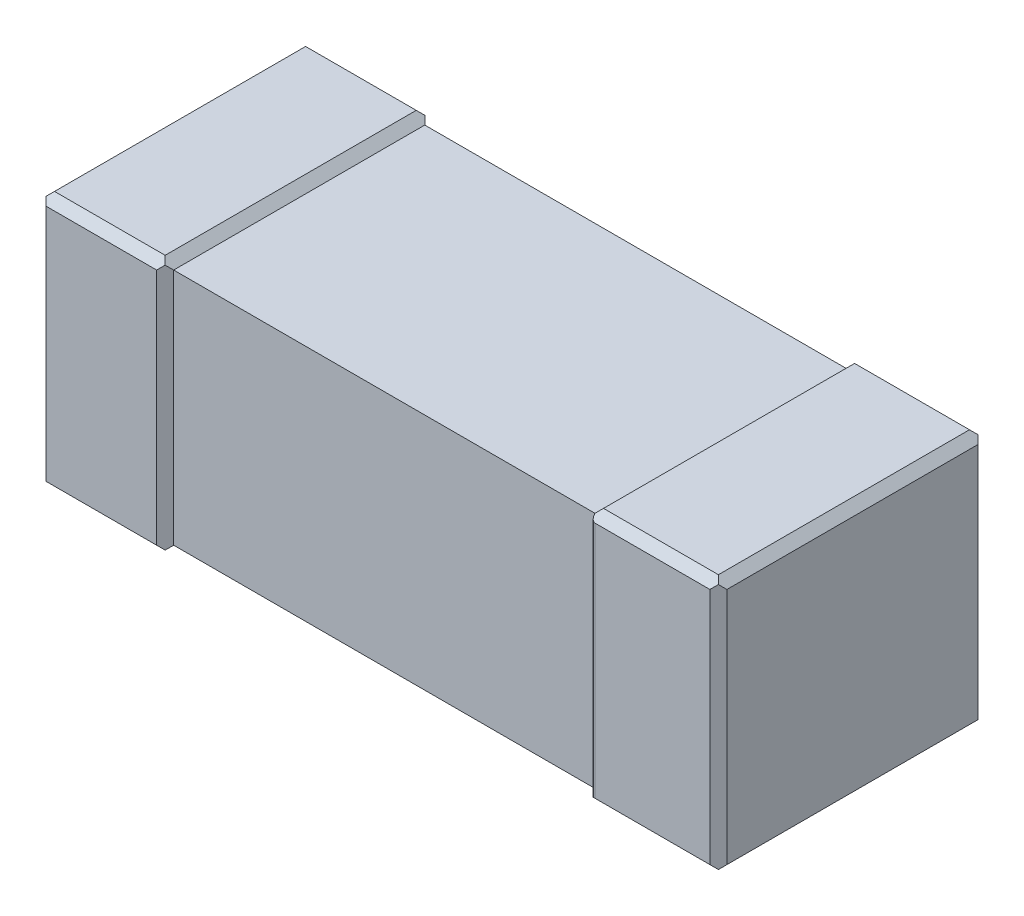
ISO-10303-21;
HEADER;
FILE_DESCRIPTION(('STEP AP214'),'2;1');
FILE_NAME('part.step','',(''),(''),'','','');
FILE_SCHEMA(('AUTOMOTIVE_DESIGN { 1 0 10303 214 1 1 1 1 }'));
ENDSEC;
DATA;
#1=APPLICATION_CONTEXT('core data for automotive mechanical design processes');
#2=APPLICATION_PROTOCOL_DEFINITION('international standard','automotive_design',2000,#1);
#3=PRODUCT_CONTEXT('',#1,'mechanical');
#4=PRODUCT('Part','Part','',(#3));
#5=PRODUCT_RELATED_PRODUCT_CATEGORY('part','',(#4));
#6=PRODUCT_DEFINITION_FORMATION('','',#4);
#7=PRODUCT_DEFINITION_CONTEXT('part definition',#1,'design');
#8=PRODUCT_DEFINITION('design','',#6,#7);
#9=PRODUCT_DEFINITION_SHAPE('','',#8);
#10=(LENGTH_UNIT() NAMED_UNIT(*) SI_UNIT(.MILLI.,.METRE.));
#11=(NAMED_UNIT(*) PLANE_ANGLE_UNIT() SI_UNIT($,.RADIAN.));
#12=(NAMED_UNIT(*) SI_UNIT($,.STERADIAN.) SOLID_ANGLE_UNIT());
#13=UNCERTAINTY_MEASURE_WITH_UNIT(LENGTH_MEASURE(1.E-05),#10,'distance_accuracy_value','');
#14=(GEOMETRIC_REPRESENTATION_CONTEXT(3) GLOBAL_UNCERTAINTY_ASSIGNED_CONTEXT((#13)) GLOBAL_UNIT_ASSIGNED_CONTEXT((#10,
#11,#12)) REPRESENTATION_CONTEXT('',''));
#15=CARTESIAN_POINT('',(0.,0.,0.));
#16=DIRECTION('',(0.,0.,1.));
#17=DIRECTION('',(1.,0.,0.));
#18=AXIS2_PLACEMENT_3D('',#15,#16,#17);
#19=CARTESIAN_POINT('',(0.8,-0.3,0.));
#20=DIRECTION('',(1.,0.,0.));
#21=DIRECTION('',(0.,0.,-1.));
#22=AXIS2_PLACEMENT_3D('',#19,#20,#21);
#23=PLANE('',#22);
#24=DIRECTION('',(0.,0.,1.));
#25=VECTOR('',#24,1.);
#26=CARTESIAN_POINT('',(0.8,0.28,0.63));
#27=LINE('',#26,#25);
#28=CARTESIAN_POINT('',(0.8,0.28,0.61));
#29=VERTEX_POINT('',#28);
#30=CARTESIAN_POINT('',(0.8,0.28,0.0199999999999999));
#31=VERTEX_POINT('',#30);
#32=EDGE_CURVE('E465',#29,#31,#27,.F.);
#33=ORIENTED_EDGE('',*,*,#32,.F.);
#34=DIRECTION('',(0.,1.,0.));
#35=VECTOR('',#34,1.);
#36=CARTESIAN_POINT('',(0.8,-0.3,0.61));
#37=LINE('',#36,#35);
#38=CARTESIAN_POINT('',(0.8,-0.28,0.61));
#39=VERTEX_POINT('',#38);
#40=EDGE_CURVE('E437',#39,#29,#37,.T.);
#41=ORIENTED_EDGE('',*,*,#40,.F.);
#42=DIRECTION('',(0.,0.,1.));
#43=VECTOR('',#42,1.);
#44=CARTESIAN_POINT('',(0.8,-0.28,0.));
#45=LINE('',#44,#43);
#46=CARTESIAN_POINT('',(0.8,-0.28,0.02));
#47=VERTEX_POINT('',#46);
#48=EDGE_CURVE('E438',#47,#39,#45,.T.);
#49=ORIENTED_EDGE('',*,*,#48,.F.);
#50=DIRECTION('',(0.,1.,0.));
#51=VECTOR('',#50,1.);
#52=CARTESIAN_POINT('',(0.8,0.3,0.02));
#53=LINE('',#52,#51);
#54=EDGE_CURVE('E464',#31,#47,#53,.F.);
#55=ORIENTED_EDGE('',*,*,#54,.F.);
#56=EDGE_LOOP('',(#33,#41,#49,#55));
#57=FACE_BOUND('',#56,.T.);
#58=ADVANCED_FACE('F16',(#57),#23,.T.);
#59=CARTESIAN_POINT('',(0.79,0.29,0.63));
#60=DIRECTION('',(0.707106781186548,0.707106781186548,0.));
#61=DIRECTION('',(-0.707106781186548,0.707106781186548,0.));
#62=AXIS2_PLACEMENT_3D('',#59,#60,#61);
#63=PLANE('',#62);
#64=DIRECTION('',(0.577350269189624,-0.577350269189627,-0.577350269189627));
#65=VECTOR('',#64,1.);
#66=CARTESIAN_POINT('',(0.78,0.3,0.02));
#67=LINE('',#66,#65);
#68=CARTESIAN_POINT('',(0.78,0.3,0.02));
#69=VERTEX_POINT('',#68);
#70=CARTESIAN_POINT('',(0.79,0.29,0.00999999999999999));
#71=VERTEX_POINT('',#70);
#72=EDGE_CURVE('E399',#69,#71,#67,.T.);
#73=ORIENTED_EDGE('',*,*,#72,.F.);
#74=DIRECTION('',(0.,0.,1.));
#75=VECTOR('',#74,1.);
#76=CARTESIAN_POINT('',(0.78,0.3,0.63));
#77=LINE('',#76,#75);
#78=CARTESIAN_POINT('',(0.78,0.3,0.61));
#79=VERTEX_POINT('',#78);
#80=EDGE_CURVE('E376',#79,#69,#77,.F.);
#81=ORIENTED_EDGE('',*,*,#80,.F.);
#82=DIRECTION('',(-0.577350269189621,0.57735026918963,-0.577350269189627));
#83=VECTOR('',#82,1.);
#84=CARTESIAN_POINT('',(0.79,0.29,0.62));
#85=LINE('',#84,#83);
#86=CARTESIAN_POINT('',(0.79,0.29,0.62));
#87=VERTEX_POINT('',#86);
#88=EDGE_CURVE('E431',#87,#79,#85,.T.);
#89=ORIENTED_EDGE('',*,*,#88,.F.);
#90=DIRECTION('',(-0.577350269189626,0.577350269189626,0.577350269189626));
#91=VECTOR('',#90,1.);
#92=CARTESIAN_POINT('',(0.8,0.28,0.61));
#93=LINE('',#92,#91);
#94=EDGE_CURVE('E478',#29,#87,#93,.T.);
#95=ORIENTED_EDGE('',*,*,#94,.F.);
#96=ORIENTED_EDGE('',*,*,#32,.T.);
#97=DIRECTION('',(0.577350269189627,-0.577350269189624,0.577350269189627));
#98=VECTOR('',#97,1.);
#99=CARTESIAN_POINT('',(0.79,0.29,0.01));
#100=LINE('',#99,#98);
#101=EDGE_CURVE('E461',#71,#31,#100,.T.);
#102=ORIENTED_EDGE('',*,*,#101,.F.);
#103=EDGE_LOOP('',(#73,#81,#89,#95,#96,#102));
#104=FACE_BOUND('',#103,.T.);
#105=ADVANCED_FACE('F951',(#104),#63,.T.);
#106=CARTESIAN_POINT('',(0.79,0.3,0.01));
#107=DIRECTION('',(0.707106781186548,0.,-0.707106781186548));
#108=DIRECTION('',(-0.707106781186548,0.,-0.707106781186548));
#109=AXIS2_PLACEMENT_3D('',#106,#107,#108);
#110=PLANE('',#109);
#111=DIRECTION('',(0.57735026918962,-0.577350269189629,0.577350269189629));
#112=VECTOR('',#111,1.);
#113=CARTESIAN_POINT('',(0.78,-0.28,0.));
#114=LINE('',#113,#112);
#115=CARTESIAN_POINT('',(0.78,-0.28,0.));
#116=VERTEX_POINT('',#115);
#117=CARTESIAN_POINT('',(0.79,-0.29,0.00999999999999999));
#118=VERTEX_POINT('',#117);
#119=EDGE_CURVE('E422',#116,#118,#114,.T.);
#120=ORIENTED_EDGE('',*,*,#119,.F.);
#121=DIRECTION('',(0.,1.,0.));
#122=VECTOR('',#121,1.);
#123=CARTESIAN_POINT('',(0.78,0.3,0.));
#124=LINE('',#123,#122);
#125=CARTESIAN_POINT('',(0.78,0.28,0.));
#126=VERTEX_POINT('',#125);
#127=EDGE_CURVE('E400',#126,#116,#124,.F.);
#128=ORIENTED_EDGE('',*,*,#127,.F.);
#129=DIRECTION('',(-0.577350269189616,-0.577350269189631,-0.57735026918963));
#130=VECTOR('',#129,1.);
#131=CARTESIAN_POINT('',(0.79,0.29,0.00999999999999998));
#132=LINE('',#131,#130);
#133=EDGE_CURVE('E377',#71,#126,#132,.T.);
#134=ORIENTED_EDGE('',*,*,#133,.F.);
#135=ORIENTED_EDGE('',*,*,#101,.T.);
#136=ORIENTED_EDGE('',*,*,#54,.T.);
#137=DIRECTION('',(0.577350269189626,0.577350269189626,0.577350269189625));
#138=VECTOR('',#137,1.);
#139=CARTESIAN_POINT('',(0.79,-0.29,0.01));
#140=LINE('',#139,#138);
#141=EDGE_CURVE('E434',#118,#47,#140,.T.);
#142=ORIENTED_EDGE('',*,*,#141,.F.);
#143=EDGE_LOOP('',(#120,#128,#134,#135,#136,#142));
#144=FACE_BOUND('',#143,.T.);
#145=ADVANCED_FACE('F941',(#144),#110,.T.);
#146=CARTESIAN_POINT('',(0.79,-0.29,0.));
#147=DIRECTION('',(0.707106781186548,-0.707106781186548,0.));
#148=DIRECTION('',(0.707106781186548,0.707106781186548,0.));
#149=AXIS2_PLACEMENT_3D('',#146,#147,#148);
#150=PLANE('',#149);
#151=DIRECTION('',(-0.577350269189624,-0.577350269189627,0.577350269189627));
#152=VECTOR('',#151,1.);
#153=CARTESIAN_POINT('',(0.79,-0.29,0.00999999999999998));
#154=LINE('',#153,#152);
#155=CARTESIAN_POINT('',(0.78,-0.3,0.02));
#156=VERTEX_POINT('',#155);
#157=EDGE_CURVE('E390',#118,#156,#154,.T.);
#158=ORIENTED_EDGE('',*,*,#157,.F.);
#159=ORIENTED_EDGE('',*,*,#141,.T.);
#160=ORIENTED_EDGE('',*,*,#48,.T.);
#161=DIRECTION('',(0.577350269189627,0.577350269189624,-0.577350269189627));
#162=VECTOR('',#161,1.);
#163=CARTESIAN_POINT('',(0.79,-0.29,0.62));
#164=LINE('',#163,#162);
#165=CARTESIAN_POINT('',(0.79,-0.29,0.62));
#166=VERTEX_POINT('',#165);
#167=EDGE_CURVE('E408',#166,#39,#164,.T.);
#168=ORIENTED_EDGE('',*,*,#167,.F.);
#169=DIRECTION('',(0.577350269189621,0.57735026918963,0.577350269189627));
#170=VECTOR('',#169,1.);
#171=CARTESIAN_POINT('',(0.78,-0.3,0.61));
#172=LINE('',#171,#170);
#173=CARTESIAN_POINT('',(0.78,-0.3,0.61));
#174=VERTEX_POINT('',#173);
#175=EDGE_CURVE('E353',#174,#166,#172,.T.);
#176=ORIENTED_EDGE('',*,*,#175,.F.);
#177=DIRECTION('',(0.,0.,-1.));
#178=VECTOR('',#177,1.);
#179=CARTESIAN_POINT('',(0.78,-0.3,0.));
#180=LINE('',#179,#178);
#181=EDGE_CURVE('E357',#156,#174,#180,.F.);
#182=ORIENTED_EDGE('',*,*,#181,.F.);
#183=EDGE_LOOP('',(#158,#159,#160,#168,#176,#182));
#184=FACE_BOUND('',#183,.T.);
#185=ADVANCED_FACE('F931',(#184),#150,.T.);
#186=CARTESIAN_POINT('',(0.79,-0.3,0.62));
#187=DIRECTION('',(0.707106781186548,0.,0.707106781186548));
#188=DIRECTION('',(0.707106781186548,0.,-0.707106781186548));
#189=AXIS2_PLACEMENT_3D('',#186,#187,#188);
#190=PLANE('',#189);
#191=DIRECTION('',(-0.577350269189624,0.577350269189624,0.57735026918963));
#192=VECTOR('',#191,1.);
#193=CARTESIAN_POINT('',(0.79,-0.29,0.62));
#194=LINE('',#193,#192);
#195=CARTESIAN_POINT('',(0.78,-0.28,0.63));
#196=VERTEX_POINT('',#195);
#197=EDGE_CURVE('E350',#166,#196,#194,.T.);
#198=ORIENTED_EDGE('',*,*,#197,.F.);
#199=ORIENTED_EDGE('',*,*,#167,.T.);
#200=ORIENTED_EDGE('',*,*,#40,.T.);
#201=ORIENTED_EDGE('',*,*,#94,.T.);
#202=DIRECTION('',(0.577350269189624,0.577350269189624,-0.57735026918963));
#203=VECTOR('',#202,1.);
#204=CARTESIAN_POINT('',(0.78,0.28,0.63));
#205=LINE('',#204,#203);
#206=CARTESIAN_POINT('',(0.78,0.28,0.63));
#207=VERTEX_POINT('',#206);
#208=EDGE_CURVE('E369',#207,#87,#205,.T.);
#209=ORIENTED_EDGE('',*,*,#208,.F.);
#210=DIRECTION('',(0.,-1.,0.));
#211=VECTOR('',#210,1.);
#212=CARTESIAN_POINT('',(0.78,-0.3,0.63));
#213=LINE('',#212,#211);
#214=EDGE_CURVE('E385',#196,#207,#213,.F.);
#215=ORIENTED_EDGE('',*,*,#214,.F.);
#216=EDGE_LOOP('',(#198,#199,#200,#201,#209,#215));
#217=FACE_BOUND('',#216,.T.);
#218=ADVANCED_FACE('F921',(#217),#190,.T.);
#219=CARTESIAN_POINT('',(-0.8,-0.3,0.63));
#220=DIRECTION('',(0.,-1.,0.));
#221=DIRECTION('',(0.,0.,-1.));
#222=AXIS2_PLACEMENT_3D('',#219,#220,#221);
#223=PLANE('',#222);
#224=DIRECTION('',(1.,0.,0.));
#225=VECTOR('',#224,1.);
#226=CARTESIAN_POINT('',(-0.52,-0.3,0.02));
#227=LINE('',#226,#225);
#228=CARTESIAN_POINT('',(-0.52,-0.3,0.0200000000000001));
#229=VERTEX_POINT('',#228);
#230=CARTESIAN_POINT('',(-0.78,-0.3,0.02));
#231=VERTEX_POINT('',#230);
#232=EDGE_CURVE('E332',#229,#231,#227,.F.);
#233=ORIENTED_EDGE('',*,*,#232,.F.);
#234=DIRECTION('',(0.,0.,1.));
#235=VECTOR('',#234,1.);
#236=CARTESIAN_POINT('',(-0.52,-0.3,0.63));
#237=LINE('',#236,#235);
#238=CARTESIAN_POINT('',(-0.52,-0.3,0.61));
#239=VERTEX_POINT('',#238);
#240=EDGE_CURVE('E318',#239,#229,#237,.F.);
#241=ORIENTED_EDGE('',*,*,#240,.F.);
#242=DIRECTION('',(1.,0.,0.));
#243=VECTOR('',#242,1.);
#244=CARTESIAN_POINT('',(-0.8,-0.3,0.61));
#245=LINE('',#244,#243);
#246=CARTESIAN_POINT('',(-0.78,-0.3,0.61));
#247=VERTEX_POINT('',#246);
#248=EDGE_CURVE('E327',#247,#239,#245,.T.);
#249=ORIENTED_EDGE('',*,*,#248,.F.);
#250=DIRECTION('',(0.,0.,1.));
#251=VECTOR('',#250,1.);
#252=CARTESIAN_POINT('',(-0.78,-0.3,0.02));
#253=LINE('',#252,#251);
#254=EDGE_CURVE('E405',#231,#247,#253,.T.);
#255=ORIENTED_EDGE('',*,*,#254,.F.);
#256=EDGE_LOOP('',(#233,#241,#249,#255));
#257=FACE_BOUND('',#256,.T.);
#258=ADVANCED_FACE('F911',(#257),#223,.T.);
#259=CARTESIAN_POINT('',(-0.79,-0.29,0.02));
#260=DIRECTION('',(-0.707106781186548,-0.707106781186548,0.));
#261=DIRECTION('',(0.707106781186548,-0.707106781186548,0.));
#262=AXIS2_PLACEMENT_3D('',#259,#260,#261);
#263=PLANE('',#262);
#264=DIRECTION('',(0.577350269189622,-0.577350269189628,-0.577350269189628));
#265=VECTOR('',#264,1.);
#266=CARTESIAN_POINT('',(-0.79,-0.29,0.62));
#267=LINE('',#266,#265);
#268=CARTESIAN_POINT('',(-0.79,-0.29,0.62));
#269=VERTEX_POINT('',#268);
#270=EDGE_CURVE('E324',#269,#247,#267,.T.);
#271=ORIENTED_EDGE('',*,*,#270,.F.);
#272=DIRECTION('',(0.577350269189628,-0.577350269189622,0.577350269189628));
#273=VECTOR('',#272,1.);
#274=CARTESIAN_POINT('',(-0.8,-0.28,0.61));
#275=LINE('',#274,#273);
#276=CARTESIAN_POINT('',(-0.8,-0.28,0.61));
#277=VERTEX_POINT('',#276);
#278=EDGE_CURVE('E310',#277,#269,#275,.T.);
#279=ORIENTED_EDGE('',*,*,#278,.F.);
#280=DIRECTION('',(0.,0.,1.));
#281=VECTOR('',#280,1.);
#282=CARTESIAN_POINT('',(-0.8,-0.28,0.));
#283=LINE('',#282,#281);
#284=CARTESIAN_POINT('',(-0.8,-0.28,0.02));
#285=VERTEX_POINT('',#284);
#286=EDGE_CURVE('E403',#285,#277,#283,.T.);
#287=ORIENTED_EDGE('',*,*,#286,.F.);
#288=DIRECTION('',(-0.577350269189629,0.577350269189623,0.577350269189626));
#289=VECTOR('',#288,1.);
#290=CARTESIAN_POINT('',(-0.79,-0.29,0.0100000000000002));
#291=LINE('',#290,#289);
#292=CARTESIAN_POINT('',(-0.79,-0.29,0.0100000000000001));
#293=VERTEX_POINT('',#292);
#294=EDGE_CURVE('E347',#293,#285,#291,.T.);
#295=ORIENTED_EDGE('',*,*,#294,.F.);
#296=DIRECTION('',(-0.577350269189624,0.577350269189627,-0.577350269189627));
#297=VECTOR('',#296,1.);
#298=CARTESIAN_POINT('',(-0.78,-0.3,0.02));
#299=LINE('',#298,#297);
#300=EDGE_CURVE('E329',#231,#293,#299,.T.);
#301=ORIENTED_EDGE('',*,*,#300,.F.);
#302=ORIENTED_EDGE('',*,*,#254,.T.);
#303=EDGE_LOOP('',(#271,#279,#287,#295,#301,#302));
#304=FACE_BOUND('',#303,.T.);
#305=ADVANCED_FACE('F901',(#304),#263,.T.);
#306=CARTESIAN_POINT('',(-0.8,0.3,0.));
#307=DIRECTION('',(-1.,0.,0.));
#308=DIRECTION('',(0.,0.,1.));
#309=AXIS2_PLACEMENT_3D('',#306,#307,#308);
#310=PLANE('',#309);
#311=ORIENTED_EDGE('',*,*,#286,.T.);
#312=DIRECTION('',(0.,1.,0.));
#313=VECTOR('',#312,1.);
#314=CARTESIAN_POINT('',(-0.8,0.28,0.61));
#315=LINE('',#314,#313);
#316=CARTESIAN_POINT('',(-0.8,0.28,0.61));
#317=VERTEX_POINT('',#316);
#318=EDGE_CURVE('E313',#317,#277,#315,.F.);
#319=ORIENTED_EDGE('',*,*,#318,.F.);
#320=DIRECTION('',(0.,0.,1.));
#321=VECTOR('',#320,1.);
#322=CARTESIAN_POINT('',(-0.8,0.28,0.));
#323=LINE('',#322,#321);
#324=CARTESIAN_POINT('',(-0.8,0.28,0.02));
#325=VERTEX_POINT('',#324);
#326=EDGE_CURVE('E298',#317,#325,#323,.F.);
#327=ORIENTED_EDGE('',*,*,#326,.T.);
#328=DIRECTION('',(0.,1.,0.));
#329=VECTOR('',#328,1.);
#330=CARTESIAN_POINT('',(-0.8,0.28,0.02));
#331=LINE('',#330,#329);
#332=EDGE_CURVE('E344',#285,#325,#331,.T.);
#333=ORIENTED_EDGE('',*,*,#332,.F.);
#334=EDGE_LOOP('',(#311,#319,#327,#333));
#335=FACE_BOUND('',#334,.T.);
#336=ADVANCED_FACE('F891',(#335),#310,.T.);
#337=CARTESIAN_POINT('',(0.5,0.3,0.));
#338=DIRECTION('',(0.,0.,-1.));
#339=DIRECTION('',(0.,1.,0.));
#340=AXIS2_PLACEMENT_3D('',#337,#338,#339);
#341=PLANE('',#340);
#342=DIRECTION('',(1.,0.,0.));
#343=VECTOR('',#342,1.);
#344=CARTESIAN_POINT('',(0.5,-0.28,0.));
#345=LINE('',#344,#343);
#346=CARTESIAN_POINT('',(0.51,-0.28,0.));
#347=VERTEX_POINT('',#346);
#348=EDGE_CURVE('E363',#347,#116,#345,.T.);
#349=ORIENTED_EDGE('',*,*,#348,.F.);
#350=DIRECTION('',(0.,1.,0.));
#351=VECTOR('',#350,1.);
#352=CARTESIAN_POINT('',(0.51,0.28,0.));
#353=LINE('',#352,#351);
#354=CARTESIAN_POINT('',(0.51,0.28,0.));
#355=VERTEX_POINT('',#354);
#356=EDGE_CURVE('E281',#347,#355,#353,.T.);
#357=ORIENTED_EDGE('',*,*,#356,.T.);
#358=DIRECTION('',(1.,0.,0.));
#359=VECTOR('',#358,1.);
#360=CARTESIAN_POINT('',(0.5,0.28,0.));
#361=LINE('',#360,#359);
#362=EDGE_CURVE('E397',#126,#355,#361,.F.);
#363=ORIENTED_EDGE('',*,*,#362,.F.);
#364=ORIENTED_EDGE('',*,*,#127,.T.);
#365=EDGE_LOOP('',(#349,#357,#363,#364));
#366=FACE_BOUND('',#365,.T.);
#367=ADVANCED_FACE('F881',(#366),#341,.T.);
#368=CARTESIAN_POINT('',(0.5,0.29,0.01));
#369=DIRECTION('',(0.,0.707106781186548,-0.707106781186548));
#370=DIRECTION('',(0.,0.707106781186548,0.707106781186548));
#371=AXIS2_PLACEMENT_3D('',#368,#369,#370);
#372=PLANE('',#371);
#373=ORIENTED_EDGE('',*,*,#72,.T.);
#374=ORIENTED_EDGE('',*,*,#133,.T.);
#375=ORIENTED_EDGE('',*,*,#362,.T.);
#376=DIRECTION('',(-0.577350269189629,0.57735026918962,0.577350269189629));
#377=VECTOR('',#376,1.);
#378=CARTESIAN_POINT('',(0.51,0.28,0.));
#379=LINE('',#378,#377);
#380=CARTESIAN_POINT('',(0.5,0.29,0.00999999999999998));
#381=VERTEX_POINT('',#380);
#382=EDGE_CURVE('E290',#355,#381,#379,.T.);
#383=ORIENTED_EDGE('',*,*,#382,.T.);
#384=DIRECTION('',(0.577350269189625,0.577350269189628,0.577350269189625));
#385=VECTOR('',#384,1.);
#386=CARTESIAN_POINT('',(0.5,0.29,0.00999999999999981));
#387=LINE('',#386,#385);
#388=CARTESIAN_POINT('',(0.51,0.3,0.0199999999999998));
#389=VERTEX_POINT('',#388);
#390=EDGE_CURVE('E280',#381,#389,#387,.T.);
#391=ORIENTED_EDGE('',*,*,#390,.T.);
#392=DIRECTION('',(1.,0.,0.));
#393=VECTOR('',#392,1.);
#394=CARTESIAN_POINT('',(0.5,0.3,0.0200000000000001));
#395=LINE('',#394,#393);
#396=EDGE_CURVE('E373',#69,#389,#395,.F.);
#397=ORIENTED_EDGE('',*,*,#396,.F.);
#398=EDGE_LOOP('',(#373,#374,#375,#383,#391,#397));
#399=FACE_BOUND('',#398,.T.);
#400=ADVANCED_FACE('F871',(#399),#372,.T.);
#401=CARTESIAN_POINT('',(0.5,0.3,0.63));
#402=DIRECTION('',(0.,1.,0.));
#403=DIRECTION('',(0.,0.,1.));
#404=AXIS2_PLACEMENT_3D('',#401,#402,#403);
#405=PLANE('',#404);
#406=DIRECTION('',(1.,0.,0.));
#407=VECTOR('',#406,1.);
#408=CARTESIAN_POINT('',(0.5,0.3,0.61));
#409=LINE('',#408,#407);
#410=CARTESIAN_POINT('',(0.51,0.3,0.61));
#411=VERTEX_POINT('',#410);
#412=EDGE_CURVE('E370',#79,#411,#409,.F.);
#413=ORIENTED_EDGE('',*,*,#412,.F.);
#414=ORIENTED_EDGE('',*,*,#80,.T.);
#415=ORIENTED_EDGE('',*,*,#396,.T.);
#416=DIRECTION('',(0.,0.,1.));
#417=VECTOR('',#416,1.);
#418=CARTESIAN_POINT('',(0.51,0.3,0.61));
#419=LINE('',#418,#417);
#420=EDGE_CURVE('E238',#389,#411,#419,.T.);
#421=ORIENTED_EDGE('',*,*,#420,.T.);
#422=EDGE_LOOP('',(#413,#414,#415,#421));
#423=FACE_BOUND('',#422,.T.);
#424=ADVANCED_FACE('F861',(#423),#405,.T.);
#425=CARTESIAN_POINT('',(0.5,-0.3,0.63));
#426=DIRECTION('',(0.,0.,1.));
#427=DIRECTION('',(0.,-1.,0.));
#428=AXIS2_PLACEMENT_3D('',#425,#426,#427);
#429=PLANE('',#428);
#430=DIRECTION('',(1.,0.,0.));
#431=VECTOR('',#430,1.);
#432=CARTESIAN_POINT('',(0.5,0.28,0.63));
#433=LINE('',#432,#431);
#434=CARTESIAN_POINT('',(0.51,0.28,0.63));
#435=VERTEX_POINT('',#434);
#436=EDGE_CURVE('E366',#435,#207,#433,.T.);
#437=ORIENTED_EDGE('',*,*,#436,.F.);
#438=DIRECTION('',(0.,1.,0.));
#439=VECTOR('',#438,1.);
#440=CARTESIAN_POINT('',(0.51,-0.28,0.63));
#441=LINE('',#440,#439);
#442=CARTESIAN_POINT('',(0.51,-0.28,0.63));
#443=VERTEX_POINT('',#442);
#444=EDGE_CURVE('E237',#443,#435,#441,.T.);
#445=ORIENTED_EDGE('',*,*,#444,.F.);
#446=DIRECTION('',(1.,0.,0.));
#447=VECTOR('',#446,1.);
#448=CARTESIAN_POINT('',(0.5,-0.28,0.63));
#449=LINE('',#448,#447);
#450=EDGE_CURVE('E233',#196,#443,#449,.F.);
#451=ORIENTED_EDGE('',*,*,#450,.F.);
#452=ORIENTED_EDGE('',*,*,#214,.T.);
#453=EDGE_LOOP('',(#437,#445,#451,#452));
#454=FACE_BOUND('',#453,.T.);
#455=ADVANCED_FACE('F851',(#454),#429,.T.);
#456=CARTESIAN_POINT('',(0.5,0.29,0.62));
#457=DIRECTION('',(0.,0.707106781186548,0.707106781186548));
#458=DIRECTION('',(0.,-0.707106781186548,0.707106781186548));
#459=AXIS2_PLACEMENT_3D('',#456,#457,#458);
#460=PLANE('',#459);
#461=ORIENTED_EDGE('',*,*,#208,.T.);
#462=ORIENTED_EDGE('',*,*,#88,.T.);
#463=ORIENTED_EDGE('',*,*,#412,.T.);
#464=DIRECTION('',(-0.577350269189626,-0.577350269189626,0.577350269189626));
#465=VECTOR('',#464,1.);
#466=CARTESIAN_POINT('',(0.51,0.3,0.61));
#467=LINE('',#466,#465);
#468=CARTESIAN_POINT('',(0.5,0.29,0.62));
#469=VERTEX_POINT('',#468);
#470=EDGE_CURVE('E278',#411,#469,#467,.T.);
#471=ORIENTED_EDGE('',*,*,#470,.T.);
#472=CARTESIAN_POINT('',(0.51,0.29,0.62));
#473=DIRECTION('',(0.,0.707106781186548,0.707106781186548));
#474=DIRECTION('',(0.,0.707106781186548,-0.707106781186548));
#475=AXIS2_PLACEMENT_3D('',#472,#473,#474);
#476=ELLIPSE('',#475,0.014142135623731,0.01);
#477=EDGE_CURVE('E244',#435,#469,#476,.F.);
#478=ORIENTED_EDGE('',*,*,#477,.F.);
#479=ORIENTED_EDGE('',*,*,#436,.T.);
#480=EDGE_LOOP('',(#461,#462,#463,#471,#478,#479));
#481=FACE_BOUND('',#480,.T.);
#482=ADVANCED_FACE('F841',(#481),#460,.T.);
#483=CARTESIAN_POINT('',(0.5,-0.29,0.01));
#484=DIRECTION('',(0.,-0.707106781186548,-0.707106781186548));
#485=DIRECTION('',(0.,0.707106781186548,-0.707106781186548));
#486=AXIS2_PLACEMENT_3D('',#483,#484,#485);
#487=PLANE('',#486);
#488=DIRECTION('',(0.577350269189628,0.577350269189621,-0.577350269189628));
#489=VECTOR('',#488,1.);
#490=CARTESIAN_POINT('',(0.5,-0.29,0.0100000000000001));
#491=LINE('',#490,#489);
#492=CARTESIAN_POINT('',(0.5,-0.29,0.0100000000000001));
#493=VERTEX_POINT('',#492);
#494=EDGE_CURVE('E287',#493,#347,#491,.T.);
#495=ORIENTED_EDGE('',*,*,#494,.T.);
#496=ORIENTED_EDGE('',*,*,#348,.T.);
#497=ORIENTED_EDGE('',*,*,#119,.T.);
#498=ORIENTED_EDGE('',*,*,#157,.T.);
#499=DIRECTION('',(1.,0.,0.));
#500=VECTOR('',#499,1.);
#501=CARTESIAN_POINT('',(0.5,-0.3,0.02));
#502=LINE('',#501,#500);
#503=CARTESIAN_POINT('',(0.51,-0.3,0.02));
#504=VERTEX_POINT('',#503);
#505=EDGE_CURVE('E360',#504,#156,#502,.T.);
#506=ORIENTED_EDGE('',*,*,#505,.F.);
#507=CARTESIAN_POINT('',(0.51,-0.29,0.01));
#508=DIRECTION('',(0.,-0.707106781186548,-0.707106781186548));
#509=DIRECTION('',(0.,-0.707106781186548,0.707106781186548));
#510=AXIS2_PLACEMENT_3D('',#507,#508,#509);
#511=ELLIPSE('',#510,0.0141421356237309,0.01);
#512=EDGE_CURVE('E491',#493,#504,#511,.F.);
#513=ORIENTED_EDGE('',*,*,#512,.F.);
#514=EDGE_LOOP('',(#495,#496,#497,#498,#506,#513));
#515=FACE_BOUND('',#514,.T.);
#516=ADVANCED_FACE('F831',(#515),#487,.T.);
#517=CARTESIAN_POINT('',(0.5,-0.3,0.));
#518=DIRECTION('',(0.,-1.,0.));
#519=DIRECTION('',(0.,0.,-1.));
#520=AXIS2_PLACEMENT_3D('',#517,#518,#519);
#521=PLANE('',#520);
#522=DIRECTION('',(1.,0.,0.));
#523=VECTOR('',#522,1.);
#524=CARTESIAN_POINT('',(0.5,-0.3,0.61));
#525=LINE('',#524,#523);
#526=CARTESIAN_POINT('',(0.51,-0.3,0.61));
#527=VERTEX_POINT('',#526);
#528=EDGE_CURVE('E351',#527,#174,#525,.T.);
#529=ORIENTED_EDGE('',*,*,#528,.F.);
#530=DIRECTION('',(0.,0.,1.));
#531=VECTOR('',#530,1.);
#532=CARTESIAN_POINT('',(0.51,-0.3,0.02));
#533=LINE('',#532,#531);
#534=EDGE_CURVE('E257',#504,#527,#533,.T.);
#535=ORIENTED_EDGE('',*,*,#534,.F.);
#536=ORIENTED_EDGE('',*,*,#505,.T.);
#537=ORIENTED_EDGE('',*,*,#181,.T.);
#538=EDGE_LOOP('',(#529,#535,#536,#537));
#539=FACE_BOUND('',#538,.T.);
#540=ADVANCED_FACE('F822',(#539),#521,.T.);
#541=CARTESIAN_POINT('',(0.5,-0.29,0.62));
#542=DIRECTION('',(0.,-0.707106781186548,0.707106781186548));
#543=DIRECTION('',(0.,-0.707106781186548,-0.707106781186548));
#544=AXIS2_PLACEMENT_3D('',#541,#542,#543);
#545=PLANE('',#544);
#546=ORIENTED_EDGE('',*,*,#175,.T.);
#547=ORIENTED_EDGE('',*,*,#197,.T.);
#548=ORIENTED_EDGE('',*,*,#450,.T.);
#549=CARTESIAN_POINT('',(0.51,-0.29,0.62));
#550=DIRECTION('',(0.,-0.707106781186548,0.707106781186548));
#551=DIRECTION('',(0.,0.707106781186548,0.707106781186548));
#552=AXIS2_PLACEMENT_3D('',#549,#550,#551);
#553=ELLIPSE('',#552,0.0141421356237309,0.01);
#554=CARTESIAN_POINT('',(0.5,-0.29,0.62));
#555=VERTEX_POINT('',#554);
#556=EDGE_CURVE('E19',#555,#443,#553,.F.);
#557=ORIENTED_EDGE('',*,*,#556,.F.);
#558=CARTESIAN_POINT('',(0.51,-0.29,0.62));
#559=DIRECTION('',(0.,-0.707106781186548,0.707106781186548));
#560=DIRECTION('',(0.,0.707106781186548,0.707106781186548));
#561=AXIS2_PLACEMENT_3D('',#558,#559,#560);
#562=ELLIPSE('',#561,0.014142135623731,0.01);
#563=EDGE_CURVE('E229',#527,#555,#562,.F.);
#564=ORIENTED_EDGE('',*,*,#563,.F.);
#565=ORIENTED_EDGE('',*,*,#528,.T.);
#566=EDGE_LOOP('',(#546,#547,#548,#557,#564,#565));
#567=FACE_BOUND('',#566,.T.);
#568=ADVANCED_FACE('F226',(#567),#545,.T.);
#569=CARTESIAN_POINT('',(-0.79,0.28,0.01));
#570=DIRECTION('',(-0.707106781186548,0.,-0.707106781186548));
#571=DIRECTION('',(-0.707106781186548,0.,0.707106781186548));
#572=AXIS2_PLACEMENT_3D('',#569,#570,#571);
#573=PLANE('',#572);
#574=ORIENTED_EDGE('',*,*,#332,.T.);
#575=DIRECTION('',(0.577350269189626,0.577350269189626,-0.577350269189625));
#576=VECTOR('',#575,1.);
#577=CARTESIAN_POINT('',(-0.8,0.28,0.02));
#578=LINE('',#577,#576);
#579=CARTESIAN_POINT('',(-0.79,0.29,0.01));
#580=VERTEX_POINT('',#579);
#581=EDGE_CURVE('E294',#325,#580,#578,.T.);
#582=ORIENTED_EDGE('',*,*,#581,.T.);
#583=DIRECTION('',(0.577350269189624,-0.577350269189627,-0.577350269189627));
#584=VECTOR('',#583,1.);
#585=CARTESIAN_POINT('',(-0.79,0.29,0.01));
#586=LINE('',#585,#584);
#587=CARTESIAN_POINT('',(-0.78,0.28,0.));
#588=VERTEX_POINT('',#587);
#589=EDGE_CURVE('E498',#580,#588,#586,.T.);
#590=ORIENTED_EDGE('',*,*,#589,.T.);
#591=DIRECTION('',(0.,1.,0.));
#592=VECTOR('',#591,1.);
#593=CARTESIAN_POINT('',(-0.78,0.3,0.));
#594=LINE('',#593,#592);
#595=CARTESIAN_POINT('',(-0.78,-0.28,0.));
#596=VERTEX_POINT('',#595);
#597=EDGE_CURVE('E341',#596,#588,#594,.T.);
#598=ORIENTED_EDGE('',*,*,#597,.F.);
#599=DIRECTION('',(0.57735026918963,0.577350269189623,-0.577350269189624));
#600=VECTOR('',#599,1.);
#601=CARTESIAN_POINT('',(-0.79,-0.29,0.01));
#602=LINE('',#601,#600);
#603=EDGE_CURVE('E338',#293,#596,#602,.T.);
#604=ORIENTED_EDGE('',*,*,#603,.F.);
#605=ORIENTED_EDGE('',*,*,#294,.T.);
#606=EDGE_LOOP('',(#574,#582,#590,#598,#604,#605));
#607=FACE_BOUND('',#606,.T.);
#608=ADVANCED_FACE('F803',(#607),#573,.T.);
#609=CARTESIAN_POINT('',(-0.5,0.3,0.));
#610=DIRECTION('',(0.,0.,-1.));
#611=DIRECTION('',(0.,1.,0.));
#612=AXIS2_PLACEMENT_3D('',#609,#610,#611);
#613=PLANE('',#612);
#614=DIRECTION('',(1.,0.,0.));
#615=VECTOR('',#614,1.);
#616=CARTESIAN_POINT('',(-0.52,-0.28,0.));
#617=LINE('',#616,#615);
#618=CARTESIAN_POINT('',(-0.52,-0.28,0.));
#619=VERTEX_POINT('',#618);
#620=EDGE_CURVE('E335',#596,#619,#617,.T.);
#621=ORIENTED_EDGE('',*,*,#620,.F.);
#622=ORIENTED_EDGE('',*,*,#597,.T.);
#623=DIRECTION('',(1.,0.,0.));
#624=VECTOR('',#623,1.);
#625=CARTESIAN_POINT('',(-0.52,0.28,0.));
#626=LINE('',#625,#624);
#627=CARTESIAN_POINT('',(-0.52,0.28,0.));
#628=VERTEX_POINT('',#627);
#629=EDGE_CURVE('E500',#588,#628,#626,.T.);
#630=ORIENTED_EDGE('',*,*,#629,.T.);
#631=DIRECTION('',(0.,1.,0.));
#632=VECTOR('',#631,1.);
#633=CARTESIAN_POINT('',(-0.52,0.3,0.));
#634=LINE('',#633,#632);
#635=EDGE_CURVE('E502',#619,#628,#634,.T.);
#636=ORIENTED_EDGE('',*,*,#635,.F.);
#637=EDGE_LOOP('',(#621,#622,#630,#636));
#638=FACE_BOUND('',#637,.T.);
#639=ADVANCED_FACE('F793',(#638),#613,.T.);
#640=CARTESIAN_POINT('',(-0.52,-0.29,0.01));
#641=DIRECTION('',(0.,-0.707106781186548,-0.707106781186548));
#642=DIRECTION('',(0.,0.707106781186548,-0.707106781186548));
#643=AXIS2_PLACEMENT_3D('',#640,#641,#642);
#644=PLANE('',#643);
#645=ORIENTED_EDGE('',*,*,#232,.T.);
#646=ORIENTED_EDGE('',*,*,#300,.T.);
#647=ORIENTED_EDGE('',*,*,#603,.T.);
#648=ORIENTED_EDGE('',*,*,#620,.T.);
#649=DIRECTION('',(-0.577350269189617,0.577350269189636,-0.577350269189625));
#650=VECTOR('',#649,1.);
#651=CARTESIAN_POINT('',(-0.51,-0.29,0.0100000000000001));
#652=LINE('',#651,#650);
#653=CARTESIAN_POINT('',(-0.51,-0.29,0.00999999999999994));
#654=VERTEX_POINT('',#653);
#655=EDGE_CURVE('E510',#654,#619,#652,.T.);
#656=ORIENTED_EDGE('',*,*,#655,.F.);
#657=DIRECTION('',(0.577350269189626,0.577350269189626,-0.577350269189626));
#658=VECTOR('',#657,1.);
#659=CARTESIAN_POINT('',(-0.52,-0.3,0.0199999999999998));
#660=LINE('',#659,#658);
#661=EDGE_CURVE('E316',#229,#654,#660,.T.);
#662=ORIENTED_EDGE('',*,*,#661,.F.);
#663=EDGE_LOOP('',(#645,#646,#647,#648,#656,#662));
#664=FACE_BOUND('',#663,.T.);
#665=ADVANCED_FACE('F784',(#664),#644,.T.);
#666=CARTESIAN_POINT('',(-0.8,-0.29,0.62));
#667=DIRECTION('',(0.,-0.707106781186548,0.707106781186548));
#668=DIRECTION('',(0.,-0.707106781186548,-0.707106781186548));
#669=AXIS2_PLACEMENT_3D('',#666,#667,#668);
#670=PLANE('',#669);
#671=DIRECTION('',(0.577350269189628,0.577350269189622,0.577350269189628));
#672=VECTOR('',#671,1.);
#673=CARTESIAN_POINT('',(-0.79,-0.29,0.62));
#674=LINE('',#673,#672);
#675=CARTESIAN_POINT('',(-0.78,-0.28,0.63));
#676=VERTEX_POINT('',#675);
#677=EDGE_CURVE('E308',#269,#676,#674,.T.);
#678=ORIENTED_EDGE('',*,*,#677,.F.);
#679=ORIENTED_EDGE('',*,*,#270,.T.);
#680=ORIENTED_EDGE('',*,*,#248,.T.);
#681=DIRECTION('',(-0.577350269189626,-0.577350269189626,-0.577350269189626));
#682=VECTOR('',#681,1.);
#683=CARTESIAN_POINT('',(-0.51,-0.29,0.62));
#684=LINE('',#683,#682);
#685=CARTESIAN_POINT('',(-0.51,-0.29,0.62));
#686=VERTEX_POINT('',#685);
#687=EDGE_CURVE('E321',#686,#239,#684,.T.);
#688=ORIENTED_EDGE('',*,*,#687,.F.);
#689=DIRECTION('',(0.577350269189632,-0.577350269189626,-0.57735026918962));
#690=VECTOR('',#689,1.);
#691=CARTESIAN_POINT('',(-0.52,-0.28,0.63));
#692=LINE('',#691,#690);
#693=CARTESIAN_POINT('',(-0.52,-0.28,0.63));
#694=VERTEX_POINT('',#693);
#695=EDGE_CURVE('E516',#694,#686,#692,.T.);
#696=ORIENTED_EDGE('',*,*,#695,.F.);
#697=DIRECTION('',(1.,0.,0.));
#698=VECTOR('',#697,1.);
#699=CARTESIAN_POINT('',(-0.8,-0.28,0.63));
#700=LINE('',#699,#698);
#701=EDGE_CURVE('E303',#676,#694,#700,.T.);
#702=ORIENTED_EDGE('',*,*,#701,.F.);
#703=EDGE_LOOP('',(#678,#679,#680,#688,#696,#702));
#704=FACE_BOUND('',#703,.T.);
#705=ADVANCED_FACE('F601',(#704),#670,.T.);
#706=CARTESIAN_POINT('',(-0.51,-0.29,0.63));
#707=DIRECTION('',(0.707106781186548,-0.707106781186548,0.));
#708=DIRECTION('',(0.707106781186548,0.707106781186548,0.));
#709=AXIS2_PLACEMENT_3D('',#706,#707,#708);
#710=PLANE('',#709);
#711=DIRECTION('',(0.,0.,-1.));
#712=VECTOR('',#711,1.);
#713=CARTESIAN_POINT('',(-0.5,-0.28,0.02));
#714=LINE('',#713,#712);
#715=CARTESIAN_POINT('',(-0.5,-0.28,0.61));
#716=VERTEX_POINT('',#715);
#717=CARTESIAN_POINT('',(-0.5,-0.28,0.0199999999999999));
#718=VERTEX_POINT('',#717);
#719=EDGE_CURVE('E258',#716,#718,#714,.T.);
#720=ORIENTED_EDGE('',*,*,#719,.F.);
#721=DIRECTION('',(0.57735026918962,0.577350269189626,-0.577350269189632));
#722=VECTOR('',#721,1.);
#723=CARTESIAN_POINT('',(-0.51,-0.29,0.62));
#724=LINE('',#723,#722);
#725=EDGE_CURVE('E519',#686,#716,#724,.T.);
#726=ORIENTED_EDGE('',*,*,#725,.F.);
#727=ORIENTED_EDGE('',*,*,#687,.T.);
#728=ORIENTED_EDGE('',*,*,#240,.T.);
#729=ORIENTED_EDGE('',*,*,#661,.T.);
#730=DIRECTION('',(-0.57735026918963,-0.577350269189624,-0.577350269189623));
#731=VECTOR('',#730,1.);
#732=CARTESIAN_POINT('',(-0.5,-0.28,0.0200000000000002));
#733=LINE('',#732,#731);
#734=EDGE_CURVE('E507',#718,#654,#733,.T.);
#735=ORIENTED_EDGE('',*,*,#734,.F.);
#736=EDGE_LOOP('',(#720,#726,#727,#728,#729,#735));
#737=FACE_BOUND('',#736,.T.);
#738=ADVANCED_FACE('F604',(#737),#710,.T.);
#739=CARTESIAN_POINT('',(-0.79,0.28,0.62));
#740=DIRECTION('',(-0.707106781186548,0.,0.707106781186548));
#741=DIRECTION('',(0.707106781186548,0.,0.707106781186548));
#742=AXIS2_PLACEMENT_3D('',#739,#740,#741);
#743=PLANE('',#742);
#744=DIRECTION('',(0.,-1.,0.));
#745=VECTOR('',#744,1.);
#746=CARTESIAN_POINT('',(-0.78,0.3,0.63));
#747=LINE('',#746,#745);
#748=CARTESIAN_POINT('',(-0.78,0.28,0.63));
#749=VERTEX_POINT('',#748);
#750=EDGE_CURVE('E305',#749,#676,#747,.T.);
#751=ORIENTED_EDGE('',*,*,#750,.F.);
#752=DIRECTION('',(-0.577350269189622,0.577350269189628,-0.577350269189628));
#753=VECTOR('',#752,1.);
#754=CARTESIAN_POINT('',(-0.78,0.28,0.63));
#755=LINE('',#754,#753);
#756=CARTESIAN_POINT('',(-0.79,0.29,0.62));
#757=VERTEX_POINT('',#756);
#758=EDGE_CURVE('E522',#749,#757,#755,.T.);
#759=ORIENTED_EDGE('',*,*,#758,.T.);
#760=DIRECTION('',(-0.577350269189627,-0.577350269189624,-0.577350269189627));
#761=VECTOR('',#760,1.);
#762=CARTESIAN_POINT('',(-0.79,0.29,0.62));
#763=LINE('',#762,#761);
#764=EDGE_CURVE('E300',#757,#317,#763,.T.);
#765=ORIENTED_EDGE('',*,*,#764,.T.);
#766=ORIENTED_EDGE('',*,*,#318,.T.);
#767=ORIENTED_EDGE('',*,*,#278,.T.);
#768=ORIENTED_EDGE('',*,*,#677,.T.);
#769=EDGE_LOOP('',(#751,#759,#765,#766,#767,#768));
#770=FACE_BOUND('',#769,.T.);
#771=ADVANCED_FACE('F758',(#770),#743,.T.);
#772=CARTESIAN_POINT('',(-0.8,0.3,0.63));
#773=DIRECTION('',(0.,0.,1.));
#774=DIRECTION('',(0.,-1.,0.));
#775=AXIS2_PLACEMENT_3D('',#772,#773,#774);
#776=PLANE('',#775);
#777=ORIENTED_EDGE('',*,*,#701,.T.);
#778=DIRECTION('',(0.,1.,0.));
#779=VECTOR('',#778,1.);
#780=CARTESIAN_POINT('',(-0.52,0.3,0.63));
#781=LINE('',#780,#779);
#782=CARTESIAN_POINT('',(-0.52,0.28,0.63));
#783=VERTEX_POINT('',#782);
#784=EDGE_CURVE('E513',#783,#694,#781,.F.);
#785=ORIENTED_EDGE('',*,*,#784,.F.);
#786=DIRECTION('',(1.,0.,0.));
#787=VECTOR('',#786,1.);
#788=CARTESIAN_POINT('',(-0.8,0.28,0.63));
#789=LINE('',#788,#787);
#790=EDGE_CURVE('E529',#783,#749,#789,.F.);
#791=ORIENTED_EDGE('',*,*,#790,.T.);
#792=ORIENTED_EDGE('',*,*,#750,.T.);
#793=EDGE_LOOP('',(#777,#785,#791,#792));
#794=FACE_BOUND('',#793,.T.);
#795=ADVANCED_FACE('F595',(#794),#776,.T.);
#796=CARTESIAN_POINT('',(-0.79,0.29,0.));
#797=DIRECTION('',(0.707106781186548,-0.707106781186548,0.));
#798=DIRECTION('',(0.707106781186548,0.707106781186548,0.));
#799=AXIS2_PLACEMENT_3D('',#796,#797,#798);
#800=PLANE('',#799);
#801=ORIENTED_EDGE('',*,*,#326,.F.);
#802=ORIENTED_EDGE('',*,*,#764,.F.);
#803=DIRECTION('',(0.577350269189622,0.577350269189628,-0.577350269189628));
#804=VECTOR('',#803,1.);
#805=CARTESIAN_POINT('',(-0.79,0.29,0.62));
#806=LINE('',#805,#804);
#807=CARTESIAN_POINT('',(-0.78,0.3,0.61));
#808=VERTEX_POINT('',#807);
#809=EDGE_CURVE('E524',#757,#808,#806,.T.);
#810=ORIENTED_EDGE('',*,*,#809,.T.);
#811=DIRECTION('',(0.,0.,-1.));
#812=VECTOR('',#811,1.);
#813=CARTESIAN_POINT('',(-0.78,0.3,0.63));
#814=LINE('',#813,#812);
#815=CARTESIAN_POINT('',(-0.78,0.3,0.02));
#816=VERTEX_POINT('',#815);
#817=EDGE_CURVE('E535',#808,#816,#814,.T.);
#818=ORIENTED_EDGE('',*,*,#817,.T.);
#819=DIRECTION('',(-0.577350269189624,-0.577350269189627,-0.577350269189627));
#820=VECTOR('',#819,1.);
#821=CARTESIAN_POINT('',(-0.78,0.3,0.02));
#822=LINE('',#821,#820);
#823=EDGE_CURVE('E495',#816,#580,#822,.T.);
#824=ORIENTED_EDGE('',*,*,#823,.T.);
#825=ORIENTED_EDGE('',*,*,#581,.F.);
#826=EDGE_LOOP('',(#801,#802,#810,#818,#824,#825));
#827=FACE_BOUND('',#826,.T.);
#828=ADVANCED_FACE('F739',(#827),#800,.F.);
#829=CARTESIAN_POINT('',(0.505,0.28,0.005));
#830=DIRECTION('',(0.707106781186548,0.,0.707106781186548));
#831=DIRECTION('',(0.707106781186548,0.,-0.707106781186548));
#832=AXIS2_PLACEMENT_3D('',#829,#830,#831);
#833=PLANE('',#832);
#834=ORIENTED_EDGE('',*,*,#494,.F.);
#835=DIRECTION('',(0.,1.,0.));
#836=VECTOR('',#835,1.);
#837=CARTESIAN_POINT('',(0.5,-0.3,0.01));
#838=LINE('',#837,#836);
#839=EDGE_CURVE('E262',#493,#381,#838,.T.);
#840=ORIENTED_EDGE('',*,*,#839,.T.);
#841=ORIENTED_EDGE('',*,*,#382,.F.);
#842=ORIENTED_EDGE('',*,*,#356,.F.);
#843=EDGE_LOOP('',(#834,#840,#841,#842));
#844=FACE_BOUND('',#843,.T.);
#845=ADVANCED_FACE('F729',(#844),#833,.F.);
#846=CARTESIAN_POINT('',(0.505,0.295,0.61));
#847=DIRECTION('',(0.707106781186548,-0.707106781186548,0.));
#848=DIRECTION('',(0.707106781186548,0.707106781186548,0.));
#849=AXIS2_PLACEMENT_3D('',#846,#847,#848);
#850=PLANE('',#849);
#851=ORIENTED_EDGE('',*,*,#390,.F.);
#852=DIRECTION('',(0.,0.,-1.));
#853=VECTOR('',#852,1.);
#854=CARTESIAN_POINT('',(0.5,0.29,0.));
#855=LINE('',#854,#853);
#856=EDGE_CURVE('E249',#381,#469,#855,.F.);
#857=ORIENTED_EDGE('',*,*,#856,.T.);
#858=ORIENTED_EDGE('',*,*,#470,.F.);
#859=ORIENTED_EDGE('',*,*,#420,.F.);
#860=EDGE_LOOP('',(#851,#857,#858,#859));
#861=FACE_BOUND('',#860,.T.);
#862=ADVANCED_FACE('F720',(#861),#850,.F.);
#863=CARTESIAN_POINT('',(0.51,-0.28,0.62));
#864=DIRECTION('',(0.,1.,0.));
#865=DIRECTION('',(0.,0.,1.));
#866=AXIS2_PLACEMENT_3D('',#863,#864,#865);
#867=CYLINDRICAL_SURFACE('',#866,0.01);
#868=ORIENTED_EDGE('',*,*,#477,.T.);
#869=DIRECTION('',(0.,1.,0.));
#870=VECTOR('',#869,1.);
#871=CARTESIAN_POINT('',(0.5,-0.3,0.62));
#872=LINE('',#871,#870);
#873=EDGE_CURVE('E241',#469,#555,#872,.F.);
#874=ORIENTED_EDGE('',*,*,#873,.T.);
#875=ORIENTED_EDGE('',*,*,#556,.T.);
#876=ORIENTED_EDGE('',*,*,#444,.T.);
#877=EDGE_LOOP('',(#868,#874,#875,#876));
#878=FACE_BOUND('',#877,.T.);
#879=ADVANCED_FACE('F242',(#878),#867,.T.);
#880=CARTESIAN_POINT('',(0.51,-0.29,0.02));
#881=DIRECTION('',(0.,0.,1.));
#882=DIRECTION('',(0.,-1.,0.));
#883=AXIS2_PLACEMENT_3D('',#880,#881,#882);
#884=CYLINDRICAL_SURFACE('',#883,0.01);
#885=ORIENTED_EDGE('',*,*,#563,.T.);
#886=DIRECTION('',(0.,0.,-1.));
#887=VECTOR('',#886,1.);
#888=CARTESIAN_POINT('',(0.5,-0.29,0.));
#889=LINE('',#888,#887);
#890=EDGE_CURVE('E248',#555,#493,#889,.T.);
#891=ORIENTED_EDGE('',*,*,#890,.T.);
#892=ORIENTED_EDGE('',*,*,#512,.T.);
#893=ORIENTED_EDGE('',*,*,#534,.T.);
#894=EDGE_LOOP('',(#885,#891,#892,#893));
#895=FACE_BOUND('',#894,.T.);
#896=ADVANCED_FACE('F253',(#895),#884,.T.);
#897=CARTESIAN_POINT('',(-0.5,-0.28,0.02));
#898=DIRECTION('',(0.,-1.,0.));
#899=DIRECTION('',(0.,0.,-1.));
#900=AXIS2_PLACEMENT_3D('',#897,#898,#899);
#901=PLANE('',#900);
#902=DIRECTION('',(1.,0.,0.));
#903=VECTOR('',#902,1.);
#904=CARTESIAN_POINT('',(-0.5,-0.28,0.61));
#905=LINE('',#904,#903);
#906=CARTESIAN_POINT('',(0.5,-0.28,0.61));
#907=VERTEX_POINT('',#906);
#908=EDGE_CURVE('E539',#716,#907,#905,.T.);
#909=ORIENTED_EDGE('',*,*,#908,.F.);
#910=ORIENTED_EDGE('',*,*,#719,.T.);
#911=DIRECTION('',(1.,0.,0.));
#912=VECTOR('',#911,1.);
#913=CARTESIAN_POINT('',(-0.5,-0.28,0.0200000000000003));
#914=LINE('',#913,#912);
#915=CARTESIAN_POINT('',(0.5,-0.28,0.02));
#916=VERTEX_POINT('',#915);
#917=EDGE_CURVE('E548',#916,#718,#914,.F.);
#918=ORIENTED_EDGE('',*,*,#917,.F.);
#919=DIRECTION('',(0.,0.,-1.));
#920=VECTOR('',#919,1.);
#921=CARTESIAN_POINT('',(0.5,-0.28,0.));
#922=LINE('',#921,#920);
#923=EDGE_CURVE('E263',#916,#907,#922,.F.);
#924=ORIENTED_EDGE('',*,*,#923,.T.);
#925=EDGE_LOOP('',(#909,#910,#918,#924));
#926=FACE_BOUND('',#925,.T.);
#927=ADVANCED_FACE('F607',(#926),#901,.T.);
#928=CARTESIAN_POINT('',(-0.52,0.29,0.01));
#929=DIRECTION('',(0.,-0.707106781186548,0.707106781186548));
#930=DIRECTION('',(0.,-0.707106781186548,-0.707106781186548));
#931=AXIS2_PLACEMENT_3D('',#928,#929,#930);
#932=PLANE('',#931);
#933=ORIENTED_EDGE('',*,*,#589,.F.);
#934=ORIENTED_EDGE('',*,*,#823,.F.);
#935=DIRECTION('',(1.,0.,0.));
#936=VECTOR('',#935,1.);
#937=CARTESIAN_POINT('',(-0.8,0.3,0.0200000000000001));
#938=LINE('',#937,#936);
#939=CARTESIAN_POINT('',(-0.52,0.3,0.0199999999999999));
#940=VERTEX_POINT('',#939);
#941=EDGE_CURVE('E537',#816,#940,#938,.T.);
#942=ORIENTED_EDGE('',*,*,#941,.T.);
#943=DIRECTION('',(0.577350269189627,-0.577350269189624,-0.577350269189627));
#944=VECTOR('',#943,1.);
#945=CARTESIAN_POINT('',(-0.52,0.3,0.0199999999999998));
#946=LINE('',#945,#944);
#947=CARTESIAN_POINT('',(-0.51,0.29,0.00999999999999995));
#948=VERTEX_POINT('',#947);
#949=EDGE_CURVE('E553',#940,#948,#946,.T.);
#950=ORIENTED_EDGE('',*,*,#949,.T.);
#951=DIRECTION('',(0.577350269189627,0.577350269189624,0.577350269189627));
#952=VECTOR('',#951,1.);
#953=CARTESIAN_POINT('',(-0.52,0.28,0.));
#954=LINE('',#953,#952);
#955=EDGE_CURVE('E505',#628,#948,#954,.T.);
#956=ORIENTED_EDGE('',*,*,#955,.F.);
#957=ORIENTED_EDGE('',*,*,#629,.F.);
#958=EDGE_LOOP('',(#933,#934,#942,#950,#956,#957));
#959=FACE_BOUND('',#958,.T.);
#960=ADVANCED_FACE('F687',(#959),#932,.F.);
#961=CARTESIAN_POINT('',(-0.51,0.3,0.01));
#962=DIRECTION('',(0.707106781186548,0.,-0.707106781186548));
#963=DIRECTION('',(-0.707106781186548,0.,-0.707106781186548));
#964=AXIS2_PLACEMENT_3D('',#961,#962,#963);
#965=PLANE('',#964);
#966=ORIENTED_EDGE('',*,*,#734,.T.);
#967=ORIENTED_EDGE('',*,*,#655,.T.);
#968=ORIENTED_EDGE('',*,*,#635,.T.);
#969=ORIENTED_EDGE('',*,*,#955,.T.);
#970=DIRECTION('',(0.577350269189626,-0.577350269189626,0.577350269189626));
#971=VECTOR('',#970,1.);
#972=CARTESIAN_POINT('',(-0.51,0.29,0.00999999999999981));
#973=LINE('',#972,#971);
#974=CARTESIAN_POINT('',(-0.5,0.28,0.02));
#975=VERTEX_POINT('',#974);
#976=EDGE_CURVE('E34',#948,#975,#973,.T.);
#977=ORIENTED_EDGE('',*,*,#976,.T.);
#978=DIRECTION('',(0.,1.,0.));
#979=VECTOR('',#978,1.);
#980=CARTESIAN_POINT('',(-0.5,0.28,0.02));
#981=LINE('',#980,#979);
#982=EDGE_CURVE('E551',#718,#975,#981,.T.);
#983=ORIENTED_EDGE('',*,*,#982,.F.);
#984=EDGE_LOOP('',(#966,#967,#968,#969,#977,#983));
#985=FACE_BOUND('',#984,.T.);
#986=ADVANCED_FACE('F678',(#985),#965,.T.);
#987=CARTESIAN_POINT('',(-0.51,0.3,0.62));
#988=DIRECTION('',(0.707106781186548,0.,0.707106781186548));
#989=DIRECTION('',(0.707106781186548,0.,-0.707106781186548));
#990=AXIS2_PLACEMENT_3D('',#987,#988,#989);
#991=PLANE('',#990);
#992=ORIENTED_EDGE('',*,*,#725,.T.);
#993=DIRECTION('',(0.,-1.,0.));
#994=VECTOR('',#993,1.);
#995=CARTESIAN_POINT('',(-0.5,-0.28,0.61));
#996=LINE('',#995,#994);
#997=CARTESIAN_POINT('',(-0.5,0.28,0.61));
#998=VERTEX_POINT('',#997);
#999=EDGE_CURVE('E270',#998,#716,#996,.T.);
#1000=ORIENTED_EDGE('',*,*,#999,.F.);
#1001=DIRECTION('',(-0.577350269189626,0.577350269189626,0.577350269189626));
#1002=VECTOR('',#1001,1.);
#1003=CARTESIAN_POINT('',(-0.5,0.28,0.61));
#1004=LINE('',#1003,#1002);
#1005=CARTESIAN_POINT('',(-0.51,0.29,0.62));
#1006=VERTEX_POINT('',#1005);
#1007=EDGE_CURVE('E556',#998,#1006,#1004,.T.);
#1008=ORIENTED_EDGE('',*,*,#1007,.T.);
#1009=DIRECTION('',(-0.577350269189626,-0.577350269189626,0.577350269189626));
#1010=VECTOR('',#1009,1.);
#1011=CARTESIAN_POINT('',(-0.51,0.29,0.62));
#1012=LINE('',#1011,#1010);
#1013=EDGE_CURVE('E526',#1006,#783,#1012,.T.);
#1014=ORIENTED_EDGE('',*,*,#1013,.T.);
#1015=ORIENTED_EDGE('',*,*,#784,.T.);
#1016=ORIENTED_EDGE('',*,*,#695,.T.);
#1017=EDGE_LOOP('',(#992,#1000,#1008,#1014,#1015,#1016));
#1018=FACE_BOUND('',#1017,.T.);
#1019=ADVANCED_FACE('F586',(#1018),#991,.T.);
#1020=CARTESIAN_POINT('',(-0.8,0.29,0.62));
#1021=DIRECTION('',(0.,-0.707106781186548,-0.707106781186548));
#1022=DIRECTION('',(0.,0.707106781186548,-0.707106781186548));
#1023=AXIS2_PLACEMENT_3D('',#1020,#1021,#1022);
#1024=PLANE('',#1023);
#1025=ORIENTED_EDGE('',*,*,#1013,.F.);
#1026=DIRECTION('',(-0.577350269189626,0.577350269189626,-0.577350269189626));
#1027=VECTOR('',#1026,1.);
#1028=CARTESIAN_POINT('',(-0.51,0.29,0.62));
#1029=LINE('',#1028,#1027);
#1030=CARTESIAN_POINT('',(-0.52,0.3,0.61));
#1031=VERTEX_POINT('',#1030);
#1032=EDGE_CURVE('E558',#1006,#1031,#1029,.T.);
#1033=ORIENTED_EDGE('',*,*,#1032,.T.);
#1034=DIRECTION('',(1.,0.,0.));
#1035=VECTOR('',#1034,1.);
#1036=CARTESIAN_POINT('',(-0.8,0.3,0.61));
#1037=LINE('',#1036,#1035);
#1038=EDGE_CURVE('E532',#1031,#808,#1037,.F.);
#1039=ORIENTED_EDGE('',*,*,#1038,.T.);
#1040=ORIENTED_EDGE('',*,*,#809,.F.);
#1041=ORIENTED_EDGE('',*,*,#758,.F.);
#1042=ORIENTED_EDGE('',*,*,#790,.F.);
#1043=EDGE_LOOP('',(#1025,#1033,#1039,#1040,#1041,#1042));
#1044=FACE_BOUND('',#1043,.T.);
#1045=ADVANCED_FACE('F590',(#1044),#1024,.F.);
#1046=CARTESIAN_POINT('',(-0.8,0.3,0.63));
#1047=DIRECTION('',(0.,-1.,0.));
#1048=DIRECTION('',(0.,0.,-1.));
#1049=AXIS2_PLACEMENT_3D('',#1046,#1047,#1048);
#1050=PLANE('',#1049);
#1051=ORIENTED_EDGE('',*,*,#817,.F.);
#1052=ORIENTED_EDGE('',*,*,#1038,.F.);
#1053=DIRECTION('',(0.,0.,1.));
#1054=VECTOR('',#1053,1.);
#1055=CARTESIAN_POINT('',(-0.52,0.3,0.63));
#1056=LINE('',#1055,#1054);
#1057=EDGE_CURVE('E560',#1031,#940,#1056,.F.);
#1058=ORIENTED_EDGE('',*,*,#1057,.T.);
#1059=ORIENTED_EDGE('',*,*,#941,.F.);
#1060=EDGE_LOOP('',(#1051,#1052,#1058,#1059));
#1061=FACE_BOUND('',#1060,.T.);
#1062=ADVANCED_FACE('F620',(#1061),#1050,.F.);
#1063=CARTESIAN_POINT('',(-0.5,-0.28,0.61));
#1064=DIRECTION('',(0.,0.,1.));
#1065=DIRECTION('',(0.,-1.,0.));
#1066=AXIS2_PLACEMENT_3D('',#1063,#1064,#1065);
#1067=PLANE('',#1066);
#1068=DIRECTION('',(1.,0.,0.));
#1069=VECTOR('',#1068,1.);
#1070=CARTESIAN_POINT('',(-0.5,0.28,0.61));
#1071=LINE('',#1070,#1069);
#1072=CARTESIAN_POINT('',(0.5,0.28,0.61));
#1073=VERTEX_POINT('',#1072);
#1074=EDGE_CURVE('E563',#998,#1073,#1071,.T.);
#1075=ORIENTED_EDGE('',*,*,#1074,.F.);
#1076=ORIENTED_EDGE('',*,*,#999,.T.);
#1077=ORIENTED_EDGE('',*,*,#908,.T.);
#1078=DIRECTION('',(0.,1.,0.));
#1079=VECTOR('',#1078,1.);
#1080=CARTESIAN_POINT('',(0.5,-0.3,0.61));
#1081=LINE('',#1080,#1079);
#1082=EDGE_CURVE('E265',#907,#1073,#1081,.T.);
#1083=ORIENTED_EDGE('',*,*,#1082,.T.);
#1084=EDGE_LOOP('',(#1075,#1076,#1077,#1083));
#1085=FACE_BOUND('',#1084,.T.);
#1086=ADVANCED_FACE('F610',(#1085),#1067,.T.);
#1087=CARTESIAN_POINT('',(0.5,-0.3,0.));
#1088=DIRECTION('',(1.,0.,0.));
#1089=DIRECTION('',(0.,0.,-1.));
#1090=AXIS2_PLACEMENT_3D('',#1087,#1088,#1089);
#1091=PLANE('',#1090);
#1092=ORIENTED_EDGE('',*,*,#1082,.F.);
#1093=ORIENTED_EDGE('',*,*,#923,.F.);
#1094=DIRECTION('',(0.,1.,0.));
#1095=VECTOR('',#1094,1.);
#1096=CARTESIAN_POINT('',(0.5,0.28,0.0199999999999998));
#1097=LINE('',#1096,#1095);
#1098=CARTESIAN_POINT('',(0.5,0.28,0.02));
#1099=VERTEX_POINT('',#1098);
#1100=EDGE_CURVE('E545',#1099,#916,#1097,.F.);
#1101=ORIENTED_EDGE('',*,*,#1100,.F.);
#1102=DIRECTION('',(0.,0.,1.));
#1103=VECTOR('',#1102,1.);
#1104=CARTESIAN_POINT('',(0.5,0.28,0.61));
#1105=LINE('',#1104,#1103);
#1106=EDGE_CURVE('E566',#1073,#1099,#1105,.F.);
#1107=ORIENTED_EDGE('',*,*,#1106,.F.);
#1108=EDGE_LOOP('',(#1092,#1093,#1101,#1107));
#1109=FACE_BOUND('',#1108,.T.);
#1110=ORIENTED_EDGE('',*,*,#873,.F.);
#1111=ORIENTED_EDGE('',*,*,#856,.F.);
#1112=ORIENTED_EDGE('',*,*,#839,.F.);
#1113=ORIENTED_EDGE('',*,*,#890,.F.);
#1114=EDGE_LOOP('',(#1110,#1111,#1112,#1113));
#1115=FACE_BOUND('',#1114,.T.);
#1116=ADVANCED_FACE('F260',(#1109,#1115),#1091,.F.);
#1117=CARTESIAN_POINT('',(-0.5,0.28,0.02));
#1118=DIRECTION('',(0.,0.,-1.));
#1119=DIRECTION('',(0.,1.,0.));
#1120=AXIS2_PLACEMENT_3D('',#1117,#1118,#1119);
#1121=PLANE('',#1120);
#1122=ORIENTED_EDGE('',*,*,#917,.T.);
#1123=ORIENTED_EDGE('',*,*,#982,.T.);
#1124=DIRECTION('',(1.,0.,0.));
#1125=VECTOR('',#1124,1.);
#1126=CARTESIAN_POINT('',(-0.5,0.28,0.0200000000000001));
#1127=LINE('',#1126,#1125);
#1128=EDGE_CURVE('E25',#1099,#975,#1127,.F.);
#1129=ORIENTED_EDGE('',*,*,#1128,.F.);
#1130=ORIENTED_EDGE('',*,*,#1100,.T.);
#1131=EDGE_LOOP('',(#1122,#1123,#1129,#1130));
#1132=FACE_BOUND('',#1131,.T.);
#1133=ADVANCED_FACE('F576',(#1132),#1121,.T.);
#1134=CARTESIAN_POINT('',(-0.51,0.29,0.63));
#1135=DIRECTION('',(-0.707106781186548,-0.707106781186548,0.));
#1136=DIRECTION('',(0.707106781186548,-0.707106781186548,0.));
#1137=AXIS2_PLACEMENT_3D('',#1134,#1135,#1136);
#1138=PLANE('',#1137);
#1139=ORIENTED_EDGE('',*,*,#1032,.F.);
#1140=ORIENTED_EDGE('',*,*,#1007,.F.);
#1141=DIRECTION('',(0.,0.,1.));
#1142=VECTOR('',#1141,1.);
#1143=CARTESIAN_POINT('',(-0.5,0.28,0.61));
#1144=LINE('',#1143,#1142);
#1145=EDGE_CURVE('E11',#975,#998,#1144,.T.);
#1146=ORIENTED_EDGE('',*,*,#1145,.F.);
#1147=ORIENTED_EDGE('',*,*,#976,.F.);
#1148=ORIENTED_EDGE('',*,*,#949,.F.);
#1149=ORIENTED_EDGE('',*,*,#1057,.F.);
#1150=EDGE_LOOP('',(#1139,#1140,#1146,#1147,#1148,#1149));
#1151=FACE_BOUND('',#1150,.T.);
#1152=ADVANCED_FACE('F581',(#1151),#1138,.F.);
#1153=CARTESIAN_POINT('',(-0.5,0.28,0.61));
#1154=DIRECTION('',(0.,1.,0.));
#1155=DIRECTION('',(0.,0.,1.));
#1156=AXIS2_PLACEMENT_3D('',#1153,#1154,#1155);
#1157=PLANE('',#1156);
#1158=ORIENTED_EDGE('',*,*,#1128,.T.);
#1159=ORIENTED_EDGE('',*,*,#1145,.T.);
#1160=ORIENTED_EDGE('',*,*,#1074,.T.);
#1161=ORIENTED_EDGE('',*,*,#1106,.T.);
#1162=EDGE_LOOP('',(#1158,#1159,#1160,#1161));
#1163=FACE_BOUND('',#1162,.T.);
#1164=ADVANCED_FACE('F572',(#1163),#1157,.T.);
#1165=CLOSED_SHELL('',(#58,#105,#145,#185,#218,#258,#305,#336,#367,#400,#424,#455,#482,#516,
#540,#568,#608,#639,#665,#705,#738,#771,#795,#828,#845,#862,#879,#896,#927,#960,#986,#1019,
#1045,#1062,#1086,#1116,#1133,#1152,#1164));
#1166=MANIFOLD_SOLID_BREP('B1',#1165);
#1167=ADVANCED_BREP_SHAPE_REPRESENTATION('',(#18,#1166),#14);
#1168=SHAPE_DEFINITION_REPRESENTATION(#9,#1167);
ENDSEC;
END-ISO-10303-21;
